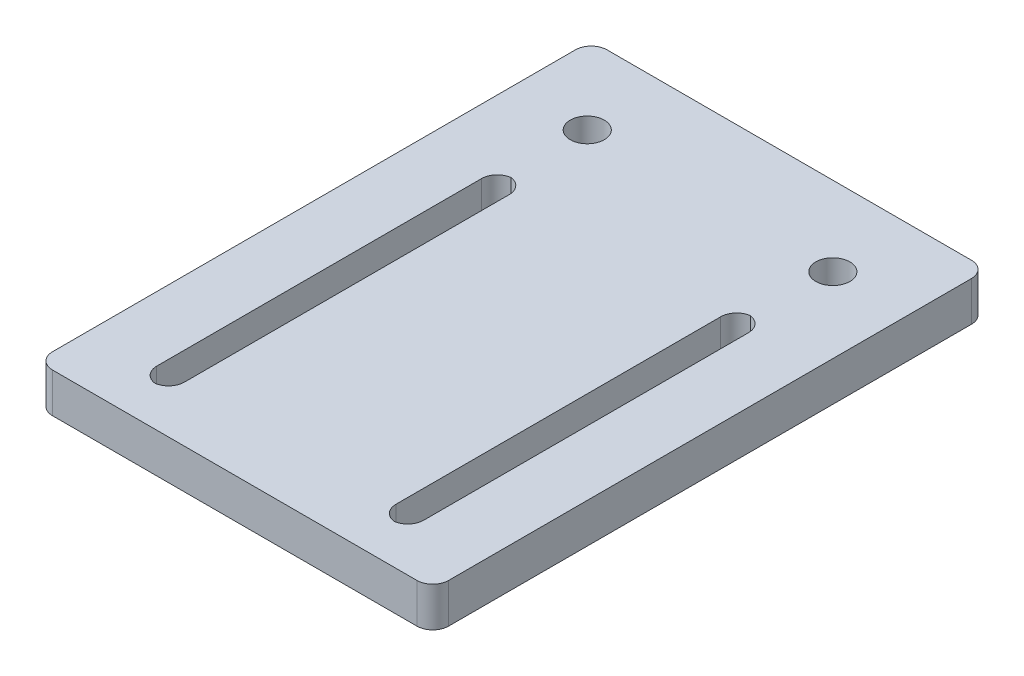
ISO-10303-21;
HEADER;
FILE_DESCRIPTION(('STEP AP214'),'2;1');
FILE_NAME('part.step','',(''),(''),'','','');
FILE_SCHEMA(('AUTOMOTIVE_DESIGN { 1 0 10303 214 1 1 1 1 }'));
ENDSEC;
DATA;
#1=APPLICATION_CONTEXT('core data for automotive mechanical design processes');
#2=APPLICATION_PROTOCOL_DEFINITION('international standard','automotive_design',2000,#1);
#3=PRODUCT_CONTEXT('',#1,'mechanical');
#4=PRODUCT('Part','Part','',(#3));
#5=PRODUCT_RELATED_PRODUCT_CATEGORY('part','',(#4));
#6=PRODUCT_DEFINITION_FORMATION('','',#4);
#7=PRODUCT_DEFINITION_CONTEXT('part definition',#1,'design');
#8=PRODUCT_DEFINITION('design','',#6,#7);
#9=PRODUCT_DEFINITION_SHAPE('','',#8);
#10=(LENGTH_UNIT() NAMED_UNIT(*) SI_UNIT(.MILLI.,.METRE.));
#11=(NAMED_UNIT(*) PLANE_ANGLE_UNIT() SI_UNIT($,.RADIAN.));
#12=(NAMED_UNIT(*) SI_UNIT($,.STERADIAN.) SOLID_ANGLE_UNIT());
#13=UNCERTAINTY_MEASURE_WITH_UNIT(LENGTH_MEASURE(1.E-05),#10,'distance_accuracy_value','');
#14=(GEOMETRIC_REPRESENTATION_CONTEXT(3) GLOBAL_UNCERTAINTY_ASSIGNED_CONTEXT((#13)) GLOBAL_UNIT_ASSIGNED_CONTEXT((#10,
#11,#12)) REPRESENTATION_CONTEXT('',''));
#15=CARTESIAN_POINT('',(0.,0.,0.));
#16=DIRECTION('',(0.,0.,1.));
#17=DIRECTION('',(1.,0.,0.));
#18=AXIS2_PLACEMENT_3D('',#15,#16,#17);
#19=CARTESIAN_POINT('',(0.,5.,0.));
#20=DIRECTION('',(0.,1.,0.));
#21=DIRECTION('',(0.,0.,1.));
#22=AXIS2_PLACEMENT_3D('',#19,#20,#21);
#23=PLANE('',#22);
#24=CARTESIAN_POINT('',(-15.5,5.,-25.));
#25=DIRECTION('',(0.,1.,0.));
#26=DIRECTION('',(0.,0.,1.));
#27=AXIS2_PLACEMENT_3D('',#24,#25,#26);
#28=CIRCLE('',#27,2.15);
#29=CARTESIAN_POINT('',(-15.5,5.,-22.85));
#30=VERTEX_POINT('',#29);
#31=EDGE_CURVE('E307',#30,#30,#28,.T.);
#32=ORIENTED_EDGE('',*,*,#31,.F.);
#33=EDGE_LOOP('',(#32));
#34=FACE_BOUND('',#33,.T.);
#35=DIRECTION('',(-1.,0.,0.));
#36=VECTOR('',#35,1.);
#37=CARTESIAN_POINT('',(-25.,5.,-35.));
#38=LINE('',#37,#36);
#39=CARTESIAN_POINT('',(23.,5.,-35.));
#40=VERTEX_POINT('',#39);
#41=CARTESIAN_POINT('',(-23.,5.,-35.));
#42=VERTEX_POINT('',#41);
#43=EDGE_CURVE('E297',#40,#42,#38,.T.);
#44=ORIENTED_EDGE('',*,*,#43,.T.);
#45=CARTESIAN_POINT('',(-23.,5.,-33.));
#46=DIRECTION('',(0.,1.,0.));
#47=DIRECTION('',(0.,0.,1.));
#48=AXIS2_PLACEMENT_3D('',#45,#46,#47);
#49=CIRCLE('',#48,2.);
#50=CARTESIAN_POINT('',(-25.,5.,-33.));
#51=VERTEX_POINT('',#50);
#52=EDGE_CURVE('E277',#42,#51,#49,.T.);
#53=ORIENTED_EDGE('',*,*,#52,.T.);
#54=DIRECTION('',(0.,0.,1.));
#55=VECTOR('',#54,1.);
#56=CARTESIAN_POINT('',(-25.,5.,-35.));
#57=LINE('',#56,#55);
#58=CARTESIAN_POINT('',(-25.,5.,33.));
#59=VERTEX_POINT('',#58);
#60=EDGE_CURVE('E309',#51,#59,#57,.T.);
#61=ORIENTED_EDGE('',*,*,#60,.T.);
#62=CARTESIAN_POINT('',(-23.,5.,33.));
#63=DIRECTION('',(0.,1.,0.));
#64=DIRECTION('',(0.,0.,1.));
#65=AXIS2_PLACEMENT_3D('',#62,#63,#64);
#66=CIRCLE('',#65,2.);
#67=CARTESIAN_POINT('',(-23.,5.,35.));
#68=VERTEX_POINT('',#67);
#69=EDGE_CURVE('E53',#59,#68,#66,.T.);
#70=ORIENTED_EDGE('',*,*,#69,.T.);
#71=DIRECTION('',(1.,0.,0.));
#72=VECTOR('',#71,1.);
#73=CARTESIAN_POINT('',(-25.,5.,35.));
#74=LINE('',#73,#72);
#75=CARTESIAN_POINT('',(23.,5.,35.));
#76=VERTEX_POINT('',#75);
#77=EDGE_CURVE('E202',#68,#76,#74,.T.);
#78=ORIENTED_EDGE('',*,*,#77,.T.);
#79=CARTESIAN_POINT('',(23.,5.,33.));
#80=DIRECTION('',(0.,1.,0.));
#81=DIRECTION('',(0.,0.,1.));
#82=AXIS2_PLACEMENT_3D('',#79,#80,#81);
#83=CIRCLE('',#82,2.);
#84=CARTESIAN_POINT('',(25.,5.,33.));
#85=VERTEX_POINT('',#84);
#86=EDGE_CURVE('E273',#76,#85,#83,.T.);
#87=ORIENTED_EDGE('',*,*,#86,.T.);
#88=DIRECTION('',(0.,0.,-1.));
#89=VECTOR('',#88,1.);
#90=CARTESIAN_POINT('',(25.,5.,-35.));
#91=LINE('',#90,#89);
#92=CARTESIAN_POINT('',(25.,5.,-33.));
#93=VERTEX_POINT('',#92);
#94=EDGE_CURVE('E294',#85,#93,#91,.T.);
#95=ORIENTED_EDGE('',*,*,#94,.T.);
#96=CARTESIAN_POINT('',(23.,5.,-33.));
#97=DIRECTION('',(0.,1.,0.));
#98=DIRECTION('',(0.,0.,1.));
#99=AXIS2_PLACEMENT_3D('',#96,#97,#98);
#100=CIRCLE('',#99,2.);
#101=EDGE_CURVE('E275',#93,#40,#100,.T.);
#102=ORIENTED_EDGE('',*,*,#101,.T.);
#103=EDGE_LOOP('',(#44,#53,#61,#70,#78,#87,#95,#102));
#104=FACE_BOUND('',#103,.T.);
#105=CARTESIAN_POINT('',(15.5,5.,-25.));
#106=DIRECTION('',(0.,1.,0.));
#107=DIRECTION('',(0.,0.,1.));
#108=AXIS2_PLACEMENT_3D('',#105,#106,#107);
#109=CIRCLE('',#108,2.15);
#110=CARTESIAN_POINT('',(15.5,5.,-22.85));
#111=VERTEX_POINT('',#110);
#112=EDGE_CURVE('E316',#111,#111,#109,.T.);
#113=ORIENTED_EDGE('',*,*,#112,.F.);
#114=EDGE_LOOP('',(#113));
#115=FACE_BOUND('',#114,.T.);
#116=CARTESIAN_POINT('',(-15.35,5.,28.));
#117=DIRECTION('',(0.,1.,0.));
#118=DIRECTION('',(0.,0.,1.));
#119=AXIS2_PLACEMENT_3D('',#116,#117,#118);
#120=CIRCLE('',#119,2.);
#121=CARTESIAN_POINT('',(-13.35,5.,28.));
#122=VERTEX_POINT('',#121);
#123=CARTESIAN_POINT('',(-15.1,5.,29.9843134832984));
#124=VERTEX_POINT('',#123);
#125=EDGE_CURVE('E218',#122,#124,#120,.F.);
#126=ORIENTED_EDGE('',*,*,#125,.T.);
#127=CARTESIAN_POINT('',(-14.85,5.,28.));
#128=DIRECTION('',(0.,1.,0.));
#129=DIRECTION('',(0.,0.,1.));
#130=AXIS2_PLACEMENT_3D('',#127,#128,#129);
#131=CIRCLE('',#130,2.);
#132=CARTESIAN_POINT('',(-16.85,5.,28.));
#133=VERTEX_POINT('',#132);
#134=EDGE_CURVE('E225',#124,#133,#131,.F.);
#135=ORIENTED_EDGE('',*,*,#134,.T.);
#136=DIRECTION('',(0.,0.,1.));
#137=VECTOR('',#136,1.);
#138=CARTESIAN_POINT('',(-16.85,5.,30.));
#139=LINE('',#138,#137);
#140=CARTESIAN_POINT('',(-16.85,5.,-13.));
#141=VERTEX_POINT('',#140);
#142=EDGE_CURVE('E328',#141,#133,#139,.T.);
#143=ORIENTED_EDGE('',*,*,#142,.F.);
#144=CARTESIAN_POINT('',(-14.85,5.,-13.));
#145=DIRECTION('',(0.,1.,0.));
#146=DIRECTION('',(0.,0.,1.));
#147=AXIS2_PLACEMENT_3D('',#144,#145,#146);
#148=CIRCLE('',#147,2.);
#149=CARTESIAN_POINT('',(-15.1,5.,-14.9843134832984));
#150=VERTEX_POINT('',#149);
#151=EDGE_CURVE('E241',#141,#150,#148,.F.);
#152=ORIENTED_EDGE('',*,*,#151,.T.);
#153=CARTESIAN_POINT('',(-15.35,5.,-13.));
#154=DIRECTION('',(0.,1.,0.));
#155=DIRECTION('',(0.,0.,1.));
#156=AXIS2_PLACEMENT_3D('',#153,#154,#155);
#157=CIRCLE('',#156,2.);
#158=CARTESIAN_POINT('',(-13.35,5.,-13.));
#159=VERTEX_POINT('',#158);
#160=EDGE_CURVE('E237',#150,#159,#157,.F.);
#161=ORIENTED_EDGE('',*,*,#160,.T.);
#162=DIRECTION('',(0.,0.,-1.));
#163=VECTOR('',#162,1.);
#164=CARTESIAN_POINT('',(-13.35,5.,30.));
#165=LINE('',#164,#163);
#166=EDGE_CURVE('E322',#122,#159,#165,.T.);
#167=ORIENTED_EDGE('',*,*,#166,.F.);
#168=EDGE_LOOP('',(#126,#135,#143,#152,#161,#167));
#169=FACE_BOUND('',#168,.T.);
#170=CARTESIAN_POINT('',(14.85,5.,28.));
#171=DIRECTION('',(0.,1.,0.));
#172=DIRECTION('',(0.,0.,1.));
#173=AXIS2_PLACEMENT_3D('',#170,#171,#172);
#174=CIRCLE('',#173,2.);
#175=CARTESIAN_POINT('',(16.85,5.,28.));
#176=VERTEX_POINT('',#175);
#177=CARTESIAN_POINT('',(15.1,5.,29.9843134832984));
#178=VERTEX_POINT('',#177);
#179=EDGE_CURVE('E181',#176,#178,#174,.F.);
#180=ORIENTED_EDGE('',*,*,#179,.T.);
#181=CARTESIAN_POINT('',(15.35,5.,28.));
#182=DIRECTION('',(0.,1.,0.));
#183=DIRECTION('',(0.,0.,1.));
#184=AXIS2_PLACEMENT_3D('',#181,#182,#183);
#185=CIRCLE('',#184,2.);
#186=CARTESIAN_POINT('',(13.35,5.,28.));
#187=VERTEX_POINT('',#186);
#188=EDGE_CURVE('E221',#178,#187,#185,.F.);
#189=ORIENTED_EDGE('',*,*,#188,.T.);
#190=DIRECTION('',(0.,0.,1.));
#191=VECTOR('',#190,1.);
#192=CARTESIAN_POINT('',(13.35,5.,30.));
#193=LINE('',#192,#191);
#194=CARTESIAN_POINT('',(13.35,5.,-13.));
#195=VERTEX_POINT('',#194);
#196=EDGE_CURVE('E193',#195,#187,#193,.T.);
#197=ORIENTED_EDGE('',*,*,#196,.F.);
#198=CARTESIAN_POINT('',(15.35,5.,-13.));
#199=DIRECTION('',(0.,1.,0.));
#200=DIRECTION('',(0.,0.,1.));
#201=AXIS2_PLACEMENT_3D('',#198,#199,#200);
#202=CIRCLE('',#201,2.);
#203=CARTESIAN_POINT('',(15.1,5.,-14.9843134832985));
#204=VERTEX_POINT('',#203);
#205=EDGE_CURVE('E233',#195,#204,#202,.F.);
#206=ORIENTED_EDGE('',*,*,#205,.T.);
#207=CARTESIAN_POINT('',(14.85,5.,-13.));
#208=DIRECTION('',(0.,1.,0.));
#209=DIRECTION('',(0.,0.,1.));
#210=AXIS2_PLACEMENT_3D('',#207,#208,#209);
#211=CIRCLE('',#210,2.);
#212=CARTESIAN_POINT('',(16.85,5.,-13.));
#213=VERTEX_POINT('',#212);
#214=EDGE_CURVE('E229',#204,#213,#211,.F.);
#215=ORIENTED_EDGE('',*,*,#214,.T.);
#216=DIRECTION('',(0.,0.,-1.));
#217=VECTOR('',#216,1.);
#218=CARTESIAN_POINT('',(16.85,5.,30.));
#219=LINE('',#218,#217);
#220=EDGE_CURVE('E332',#176,#213,#219,.T.);
#221=ORIENTED_EDGE('',*,*,#220,.F.);
#222=EDGE_LOOP('',(#180,#189,#197,#206,#215,#221));
#223=FACE_BOUND('',#222,.T.);
#224=ADVANCED_FACE('F33',(#34,#104,#115,#169,#223),#23,.T.);
#225=CARTESIAN_POINT('',(0.,0.,0.));
#226=DIRECTION('',(0.,1.,0.));
#227=DIRECTION('',(0.,0.,1.));
#228=AXIS2_PLACEMENT_3D('',#225,#226,#227);
#229=PLANE('',#228);
#230=CARTESIAN_POINT('',(-15.35,0.,-13.));
#231=DIRECTION('',(0.,1.,0.));
#232=DIRECTION('',(0.,0.,1.));
#233=AXIS2_PLACEMENT_3D('',#230,#231,#232);
#234=CIRCLE('',#233,2.);
#235=CARTESIAN_POINT('',(-13.35,0.,-13.));
#236=VERTEX_POINT('',#235);
#237=CARTESIAN_POINT('',(-15.1,0.,-14.9843134832984));
#238=VERTEX_POINT('',#237);
#239=EDGE_CURVE('E235',#236,#238,#234,.T.);
#240=ORIENTED_EDGE('',*,*,#239,.T.);
#241=CARTESIAN_POINT('',(-14.85,0.,-13.));
#242=DIRECTION('',(0.,1.,0.));
#243=DIRECTION('',(0.,0.,1.));
#244=AXIS2_PLACEMENT_3D('',#241,#242,#243);
#245=CIRCLE('',#244,2.);
#246=CARTESIAN_POINT('',(-16.85,0.,-13.));
#247=VERTEX_POINT('',#246);
#248=EDGE_CURVE('E239',#238,#247,#245,.T.);
#249=ORIENTED_EDGE('',*,*,#248,.T.);
#250=DIRECTION('',(0.,0.,1.));
#251=VECTOR('',#250,1.);
#252=CARTESIAN_POINT('',(-16.85,0.,30.));
#253=LINE('',#252,#251);
#254=CARTESIAN_POINT('',(-16.85,0.,28.));
#255=VERTEX_POINT('',#254);
#256=EDGE_CURVE('E329',#247,#255,#253,.T.);
#257=ORIENTED_EDGE('',*,*,#256,.T.);
#258=CARTESIAN_POINT('',(-14.85,0.,28.));
#259=DIRECTION('',(0.,1.,0.));
#260=DIRECTION('',(0.,0.,1.));
#261=AXIS2_PLACEMENT_3D('',#258,#259,#260);
#262=CIRCLE('',#261,2.);
#263=CARTESIAN_POINT('',(-15.1,0.,29.9843134832984));
#264=VERTEX_POINT('',#263);
#265=EDGE_CURVE('E223',#255,#264,#262,.T.);
#266=ORIENTED_EDGE('',*,*,#265,.T.);
#267=CARTESIAN_POINT('',(-15.35,0.,28.));
#268=DIRECTION('',(0.,1.,0.));
#269=DIRECTION('',(0.,0.,1.));
#270=AXIS2_PLACEMENT_3D('',#267,#268,#269);
#271=CIRCLE('',#270,2.);
#272=CARTESIAN_POINT('',(-13.35,0.,28.));
#273=VERTEX_POINT('',#272);
#274=EDGE_CURVE('E216',#264,#273,#271,.T.);
#275=ORIENTED_EDGE('',*,*,#274,.T.);
#276=DIRECTION('',(0.,0.,-1.));
#277=VECTOR('',#276,1.);
#278=CARTESIAN_POINT('',(-13.35,0.,30.));
#279=LINE('',#278,#277);
#280=EDGE_CURVE('E325',#273,#236,#279,.T.);
#281=ORIENTED_EDGE('',*,*,#280,.T.);
#282=EDGE_LOOP('',(#240,#249,#257,#266,#275,#281));
#283=FACE_BOUND('',#282,.T.);
#284=DIRECTION('',(0.,0.,1.));
#285=VECTOR('',#284,1.);
#286=CARTESIAN_POINT('',(-25.,0.,-35.));
#287=LINE('',#286,#285);
#288=CARTESIAN_POINT('',(-25.,0.,-33.));
#289=VERTEX_POINT('',#288);
#290=CARTESIAN_POINT('',(-25.,0.,33.));
#291=VERTEX_POINT('',#290);
#292=EDGE_CURVE('E295',#289,#291,#287,.T.);
#293=ORIENTED_EDGE('',*,*,#292,.F.);
#294=CARTESIAN_POINT('',(-23.,0.,-33.));
#295=DIRECTION('',(0.,1.,0.));
#296=DIRECTION('',(0.,0.,1.));
#297=AXIS2_PLACEMENT_3D('',#294,#295,#296);
#298=CIRCLE('',#297,2.);
#299=CARTESIAN_POINT('',(-23.,0.,-35.));
#300=VERTEX_POINT('',#299);
#301=EDGE_CURVE('E265',#289,#300,#298,.F.);
#302=ORIENTED_EDGE('',*,*,#301,.T.);
#303=DIRECTION('',(-1.,0.,0.));
#304=VECTOR('',#303,1.);
#305=CARTESIAN_POINT('',(-25.,0.,-35.));
#306=LINE('',#305,#304);
#307=CARTESIAN_POINT('',(23.,0.,-35.));
#308=VERTEX_POINT('',#307);
#309=EDGE_CURVE('E299',#308,#300,#306,.T.);
#310=ORIENTED_EDGE('',*,*,#309,.F.);
#311=CARTESIAN_POINT('',(23.,0.,-33.));
#312=DIRECTION('',(0.,1.,0.));
#313=DIRECTION('',(0.,0.,1.));
#314=AXIS2_PLACEMENT_3D('',#311,#312,#313);
#315=CIRCLE('',#314,2.);
#316=CARTESIAN_POINT('',(25.,0.,-33.));
#317=VERTEX_POINT('',#316);
#318=EDGE_CURVE('E263',#308,#317,#315,.F.);
#319=ORIENTED_EDGE('',*,*,#318,.T.);
#320=DIRECTION('',(0.,0.,-1.));
#321=VECTOR('',#320,1.);
#322=CARTESIAN_POINT('',(25.,0.,-35.));
#323=LINE('',#322,#321);
#324=CARTESIAN_POINT('',(25.,0.,33.));
#325=VERTEX_POINT('',#324);
#326=EDGE_CURVE('E304',#325,#317,#323,.T.);
#327=ORIENTED_EDGE('',*,*,#326,.F.);
#328=CARTESIAN_POINT('',(23.,0.,33.));
#329=DIRECTION('',(0.,1.,0.));
#330=DIRECTION('',(0.,0.,1.));
#331=AXIS2_PLACEMENT_3D('',#328,#329,#330);
#332=CIRCLE('',#331,2.);
#333=CARTESIAN_POINT('',(23.,0.,35.));
#334=VERTEX_POINT('',#333);
#335=EDGE_CURVE('E261',#325,#334,#332,.F.);
#336=ORIENTED_EDGE('',*,*,#335,.T.);
#337=DIRECTION('',(1.,0.,0.));
#338=VECTOR('',#337,1.);
#339=CARTESIAN_POINT('',(-25.,0.,35.));
#340=LINE('',#339,#338);
#341=CARTESIAN_POINT('',(-23.,0.,35.));
#342=VERTEX_POINT('',#341);
#343=EDGE_CURVE('E287',#342,#334,#340,.T.);
#344=ORIENTED_EDGE('',*,*,#343,.F.);
#345=CARTESIAN_POINT('',(-23.,0.,33.));
#346=DIRECTION('',(0.,1.,0.));
#347=DIRECTION('',(0.,0.,1.));
#348=AXIS2_PLACEMENT_3D('',#345,#346,#347);
#349=CIRCLE('',#348,2.);
#350=EDGE_CURVE('E259',#342,#291,#349,.F.);
#351=ORIENTED_EDGE('',*,*,#350,.T.);
#352=EDGE_LOOP('',(#293,#302,#310,#319,#327,#336,#344,#351));
#353=FACE_BOUND('',#352,.T.);
#354=CARTESIAN_POINT('',(-15.5,0.,-25.));
#355=DIRECTION('',(0.,1.,0.));
#356=DIRECTION('',(0.,0.,1.));
#357=AXIS2_PLACEMENT_3D('',#354,#355,#356);
#358=CIRCLE('',#357,2.15);
#359=CARTESIAN_POINT('',(-15.5,0.,-22.85));
#360=VERTEX_POINT('',#359);
#361=EDGE_CURVE('E313',#360,#360,#358,.T.);
#362=ORIENTED_EDGE('',*,*,#361,.T.);
#363=EDGE_LOOP('',(#362));
#364=FACE_BOUND('',#363,.T.);
#365=CARTESIAN_POINT('',(15.5,0.,-25.));
#366=DIRECTION('',(0.,1.,0.));
#367=DIRECTION('',(0.,0.,1.));
#368=AXIS2_PLACEMENT_3D('',#365,#366,#367);
#369=CIRCLE('',#368,2.15);
#370=CARTESIAN_POINT('',(15.5,0.,-22.85));
#371=VERTEX_POINT('',#370);
#372=EDGE_CURVE('E319',#371,#371,#369,.T.);
#373=ORIENTED_EDGE('',*,*,#372,.T.);
#374=EDGE_LOOP('',(#373));
#375=FACE_BOUND('',#374,.T.);
#376=CARTESIAN_POINT('',(14.85,0.,-13.));
#377=DIRECTION('',(0.,1.,0.));
#378=DIRECTION('',(0.,0.,1.));
#379=AXIS2_PLACEMENT_3D('',#376,#377,#378);
#380=CIRCLE('',#379,2.);
#381=CARTESIAN_POINT('',(16.85,0.,-13.));
#382=VERTEX_POINT('',#381);
#383=CARTESIAN_POINT('',(15.1,0.,-14.9843134832985));
#384=VERTEX_POINT('',#383);
#385=EDGE_CURVE('E227',#382,#384,#380,.T.);
#386=ORIENTED_EDGE('',*,*,#385,.T.);
#387=CARTESIAN_POINT('',(15.35,0.,-13.));
#388=DIRECTION('',(0.,1.,0.));
#389=DIRECTION('',(0.,0.,1.));
#390=AXIS2_PLACEMENT_3D('',#387,#388,#389);
#391=CIRCLE('',#390,2.);
#392=CARTESIAN_POINT('',(13.35,0.,-13.));
#393=VERTEX_POINT('',#392);
#394=EDGE_CURVE('E231',#384,#393,#391,.T.);
#395=ORIENTED_EDGE('',*,*,#394,.T.);
#396=DIRECTION('',(0.,0.,1.));
#397=VECTOR('',#396,1.);
#398=CARTESIAN_POINT('',(13.35,0.,30.));
#399=LINE('',#398,#397);
#400=CARTESIAN_POINT('',(13.35,0.,28.));
#401=VERTEX_POINT('',#400);
#402=EDGE_CURVE('E194',#393,#401,#399,.T.);
#403=ORIENTED_EDGE('',*,*,#402,.T.);
#404=CARTESIAN_POINT('',(15.35,0.,28.));
#405=DIRECTION('',(0.,1.,0.));
#406=DIRECTION('',(0.,0.,1.));
#407=AXIS2_PLACEMENT_3D('',#404,#405,#406);
#408=CIRCLE('',#407,2.);
#409=CARTESIAN_POINT('',(15.1,0.,29.9843134832984));
#410=VERTEX_POINT('',#409);
#411=EDGE_CURVE('E176',#401,#410,#408,.T.);
#412=ORIENTED_EDGE('',*,*,#411,.T.);
#413=CARTESIAN_POINT('',(14.85,0.,28.));
#414=DIRECTION('',(0.,1.,0.));
#415=DIRECTION('',(0.,0.,1.));
#416=AXIS2_PLACEMENT_3D('',#413,#414,#415);
#417=CIRCLE('',#416,2.);
#418=CARTESIAN_POINT('',(16.85,0.,28.));
#419=VERTEX_POINT('',#418);
#420=EDGE_CURVE('E170',#410,#419,#417,.T.);
#421=ORIENTED_EDGE('',*,*,#420,.T.);
#422=DIRECTION('',(0.,0.,-1.));
#423=VECTOR('',#422,1.);
#424=CARTESIAN_POINT('',(16.85,0.,30.));
#425=LINE('',#424,#423);
#426=EDGE_CURVE('E173',#419,#382,#425,.T.);
#427=ORIENTED_EDGE('',*,*,#426,.T.);
#428=EDGE_LOOP('',(#386,#395,#403,#412,#421,#427));
#429=FACE_BOUND('',#428,.T.);
#430=ADVANCED_FACE('F172',(#283,#353,#364,#375,#429),#229,.F.);
#431=CARTESIAN_POINT('',(25.,5.,-35.));
#432=DIRECTION('',(-1.,0.,0.));
#433=DIRECTION('',(0.,0.,1.));
#434=AXIS2_PLACEMENT_3D('',#431,#432,#433);
#435=PLANE('',#434);
#436=ORIENTED_EDGE('',*,*,#326,.T.);
#437=DIRECTION('',(0.,-1.,0.));
#438=VECTOR('',#437,1.);
#439=CARTESIAN_POINT('',(25.,5.,-33.));
#440=LINE('',#439,#438);
#441=EDGE_CURVE('E282',#317,#93,#440,.F.);
#442=ORIENTED_EDGE('',*,*,#441,.T.);
#443=ORIENTED_EDGE('',*,*,#94,.F.);
#444=DIRECTION('',(0.,-1.,0.));
#445=VECTOR('',#444,1.);
#446=CARTESIAN_POINT('',(25.,5.,33.));
#447=LINE('',#446,#445);
#448=EDGE_CURVE('E279',#85,#325,#447,.T.);
#449=ORIENTED_EDGE('',*,*,#448,.T.);
#450=EDGE_LOOP('',(#436,#442,#443,#449));
#451=FACE_BOUND('',#450,.T.);
#452=ADVANCED_FACE('F377',(#451),#435,.F.);
#453=CARTESIAN_POINT('',(-25.,5.,-35.));
#454=DIRECTION('',(0.,0.,1.));
#455=DIRECTION('',(1.,0.,0.));
#456=AXIS2_PLACEMENT_3D('',#453,#454,#455);
#457=PLANE('',#456);
#458=ORIENTED_EDGE('',*,*,#309,.T.);
#459=DIRECTION('',(0.,-1.,0.));
#460=VECTOR('',#459,1.);
#461=CARTESIAN_POINT('',(-23.,5.,-35.));
#462=LINE('',#461,#460);
#463=EDGE_CURVE('E270',#300,#42,#462,.F.);
#464=ORIENTED_EDGE('',*,*,#463,.T.);
#465=ORIENTED_EDGE('',*,*,#43,.F.);
#466=DIRECTION('',(0.,-1.,0.));
#467=VECTOR('',#466,1.);
#468=CARTESIAN_POINT('',(23.,5.,-35.));
#469=LINE('',#468,#467);
#470=EDGE_CURVE('E267',#40,#308,#469,.T.);
#471=ORIENTED_EDGE('',*,*,#470,.T.);
#472=EDGE_LOOP('',(#458,#464,#465,#471));
#473=FACE_BOUND('',#472,.T.);
#474=ADVANCED_FACE('F390',(#473),#457,.F.);
#475=CARTESIAN_POINT('',(-25.,5.,-35.));
#476=DIRECTION('',(1.,0.,0.));
#477=DIRECTION('',(0.,0.,-1.));
#478=AXIS2_PLACEMENT_3D('',#475,#476,#477);
#479=PLANE('',#478);
#480=ORIENTED_EDGE('',*,*,#60,.F.);
#481=DIRECTION('',(0.,-1.,0.));
#482=VECTOR('',#481,1.);
#483=CARTESIAN_POINT('',(-25.,5.,-33.));
#484=LINE('',#483,#482);
#485=EDGE_CURVE('E256',#51,#289,#484,.T.);
#486=ORIENTED_EDGE('',*,*,#485,.T.);
#487=ORIENTED_EDGE('',*,*,#292,.T.);
#488=DIRECTION('',(0.,-1.,0.));
#489=VECTOR('',#488,1.);
#490=CARTESIAN_POINT('',(-25.,5.,33.));
#491=LINE('',#490,#489);
#492=EDGE_CURVE('E243',#291,#59,#491,.F.);
#493=ORIENTED_EDGE('',*,*,#492,.T.);
#494=EDGE_LOOP('',(#480,#486,#487,#493));
#495=FACE_BOUND('',#494,.T.);
#496=ADVANCED_FACE('F387',(#495),#479,.F.);
#497=CARTESIAN_POINT('',(-25.,5.,35.));
#498=DIRECTION('',(0.,0.,-1.));
#499=DIRECTION('',(-1.,0.,0.));
#500=AXIS2_PLACEMENT_3D('',#497,#498,#499);
#501=PLANE('',#500);
#502=ORIENTED_EDGE('',*,*,#343,.T.);
#503=DIRECTION('',(0.,-1.,0.));
#504=VECTOR('',#503,1.);
#505=CARTESIAN_POINT('',(23.,5.,35.));
#506=LINE('',#505,#504);
#507=EDGE_CURVE('E11',#334,#76,#506,.F.);
#508=ORIENTED_EDGE('',*,*,#507,.T.);
#509=ORIENTED_EDGE('',*,*,#77,.F.);
#510=DIRECTION('',(0.,-1.,0.));
#511=VECTOR('',#510,1.);
#512=CARTESIAN_POINT('',(-23.,5.,35.));
#513=LINE('',#512,#511);
#514=EDGE_CURVE('E41',#68,#342,#513,.T.);
#515=ORIENTED_EDGE('',*,*,#514,.T.);
#516=EDGE_LOOP('',(#502,#508,#509,#515));
#517=FACE_BOUND('',#516,.T.);
#518=ADVANCED_FACE('F286',(#517),#501,.F.);
#519=CARTESIAN_POINT('',(-15.5,5.,-25.));
#520=DIRECTION('',(0.,-1.,0.));
#521=DIRECTION('',(0.,0.,-1.));
#522=AXIS2_PLACEMENT_3D('',#519,#520,#521);
#523=CYLINDRICAL_SURFACE('',#522,2.15);
#524=ORIENTED_EDGE('',*,*,#31,.T.);
#525=EDGE_LOOP('',(#524));
#526=FACE_BOUND('',#525,.T.);
#527=ORIENTED_EDGE('',*,*,#361,.F.);
#528=EDGE_LOOP('',(#527));
#529=FACE_BOUND('',#528,.T.);
#530=ADVANCED_FACE('F382',(#526,#529),#523,.F.);
#531=CARTESIAN_POINT('',(15.5,5.,-25.));
#532=DIRECTION('',(0.,-1.,0.));
#533=DIRECTION('',(0.,0.,-1.));
#534=AXIS2_PLACEMENT_3D('',#531,#532,#533);
#535=CYLINDRICAL_SURFACE('',#534,2.15);
#536=ORIENTED_EDGE('',*,*,#112,.T.);
#537=EDGE_LOOP('',(#536));
#538=FACE_BOUND('',#537,.T.);
#539=ORIENTED_EDGE('',*,*,#372,.F.);
#540=EDGE_LOOP('',(#539));
#541=FACE_BOUND('',#540,.T.);
#542=ADVANCED_FACE('F437',(#538,#541),#535,.F.);
#543=CARTESIAN_POINT('',(-16.85,5.,30.));
#544=DIRECTION('',(1.,0.,0.));
#545=DIRECTION('',(0.,0.,-1.));
#546=AXIS2_PLACEMENT_3D('',#543,#544,#545);
#547=PLANE('',#546);
#548=ORIENTED_EDGE('',*,*,#142,.T.);
#549=DIRECTION('',(0.,-1.,0.));
#550=VECTOR('',#549,1.);
#551=CARTESIAN_POINT('',(-16.85,0.,28.));
#552=LINE('',#551,#550);
#553=EDGE_CURVE('E182',#133,#255,#552,.T.);
#554=ORIENTED_EDGE('',*,*,#553,.T.);
#555=ORIENTED_EDGE('',*,*,#256,.F.);
#556=DIRECTION('',(0.,-1.,0.));
#557=VECTOR('',#556,1.);
#558=CARTESIAN_POINT('',(-16.85,5.,-13.));
#559=LINE('',#558,#557);
#560=EDGE_CURVE('E212',#247,#141,#559,.F.);
#561=ORIENTED_EDGE('',*,*,#560,.T.);
#562=EDGE_LOOP('',(#548,#554,#555,#561));
#563=FACE_BOUND('',#562,.T.);
#564=ADVANCED_FACE('F412',(#563),#547,.T.);
#565=CARTESIAN_POINT('',(-13.35,5.,30.));
#566=DIRECTION('',(-1.,0.,0.));
#567=DIRECTION('',(0.,0.,1.));
#568=AXIS2_PLACEMENT_3D('',#565,#566,#567);
#569=PLANE('',#568);
#570=ORIENTED_EDGE('',*,*,#280,.F.);
#571=DIRECTION('',(0.,-1.,0.));
#572=VECTOR('',#571,1.);
#573=CARTESIAN_POINT('',(-13.35,5.,28.));
#574=LINE('',#573,#572);
#575=EDGE_CURVE('E200',#273,#122,#574,.F.);
#576=ORIENTED_EDGE('',*,*,#575,.T.);
#577=ORIENTED_EDGE('',*,*,#166,.T.);
#578=DIRECTION('',(0.,-1.,0.));
#579=VECTOR('',#578,1.);
#580=CARTESIAN_POINT('',(-13.35,0.,-13.));
#581=LINE('',#580,#579);
#582=EDGE_CURVE('E197',#159,#236,#581,.T.);
#583=ORIENTED_EDGE('',*,*,#582,.T.);
#584=EDGE_LOOP('',(#570,#576,#577,#583));
#585=FACE_BOUND('',#584,.T.);
#586=ADVANCED_FACE('F427',(#585),#569,.T.);
#587=CARTESIAN_POINT('',(13.35,5.,30.));
#588=DIRECTION('',(1.,0.,0.));
#589=DIRECTION('',(0.,0.,-1.));
#590=AXIS2_PLACEMENT_3D('',#587,#588,#589);
#591=PLANE('',#590);
#592=ORIENTED_EDGE('',*,*,#196,.T.);
#593=DIRECTION('',(0.,-1.,0.));
#594=VECTOR('',#593,1.);
#595=CARTESIAN_POINT('',(13.35,0.,28.));
#596=LINE('',#595,#594);
#597=EDGE_CURVE('E210',#187,#401,#596,.T.);
#598=ORIENTED_EDGE('',*,*,#597,.T.);
#599=ORIENTED_EDGE('',*,*,#402,.F.);
#600=DIRECTION('',(0.,-1.,0.));
#601=VECTOR('',#600,1.);
#602=CARTESIAN_POINT('',(13.35,5.,-13.));
#603=LINE('',#602,#601);
#604=EDGE_CURVE('E208',#393,#195,#603,.F.);
#605=ORIENTED_EDGE('',*,*,#604,.T.);
#606=EDGE_LOOP('',(#592,#598,#599,#605));
#607=FACE_BOUND('',#606,.T.);
#608=ADVANCED_FACE('F343',(#607),#591,.T.);
#609=CARTESIAN_POINT('',(16.85,5.,30.));
#610=DIRECTION('',(-1.,0.,0.));
#611=DIRECTION('',(0.,0.,1.));
#612=AXIS2_PLACEMENT_3D('',#609,#610,#611);
#613=PLANE('',#612);
#614=ORIENTED_EDGE('',*,*,#426,.F.);
#615=DIRECTION('',(0.,-1.,0.));
#616=VECTOR('',#615,1.);
#617=CARTESIAN_POINT('',(16.85,5.,28.));
#618=LINE('',#617,#616);
#619=EDGE_CURVE('E189',#419,#176,#618,.F.);
#620=ORIENTED_EDGE('',*,*,#619,.T.);
#621=ORIENTED_EDGE('',*,*,#220,.T.);
#622=DIRECTION('',(0.,-1.,0.));
#623=VECTOR('',#622,1.);
#624=CARTESIAN_POINT('',(16.85,0.,-13.));
#625=LINE('',#624,#623);
#626=EDGE_CURVE('E192',#213,#382,#625,.T.);
#627=ORIENTED_EDGE('',*,*,#626,.T.);
#628=EDGE_LOOP('',(#614,#620,#621,#627));
#629=FACE_BOUND('',#628,.T.);
#630=ADVANCED_FACE('F187',(#629),#613,.T.);
#631=CARTESIAN_POINT('',(15.35,5.,28.));
#632=DIRECTION('',(0.,1.,0.));
#633=DIRECTION('',(0.,0.,1.));
#634=AXIS2_PLACEMENT_3D('',#631,#632,#633);
#635=CYLINDRICAL_SURFACE('',#634,2.);
#636=ORIENTED_EDGE('',*,*,#597,.F.);
#637=ORIENTED_EDGE('',*,*,#188,.F.);
#638=DIRECTION('',(0.,1.,0.));
#639=VECTOR('',#638,1.);
#640=CARTESIAN_POINT('',(15.1,2.5,29.9843134832984));
#641=LINE('',#640,#639);
#642=EDGE_CURVE('E244',#410,#178,#641,.T.);
#643=ORIENTED_EDGE('',*,*,#642,.F.);
#644=ORIENTED_EDGE('',*,*,#411,.F.);
#645=EDGE_LOOP('',(#636,#637,#643,#644));
#646=FACE_BOUND('',#645,.T.);
#647=ADVANCED_FACE('F350',(#646),#635,.F.);
#648=CARTESIAN_POINT('',(14.85,5.,28.));
#649=DIRECTION('',(0.,1.,0.));
#650=DIRECTION('',(0.,0.,1.));
#651=AXIS2_PLACEMENT_3D('',#648,#649,#650);
#652=CYLINDRICAL_SURFACE('',#651,2.);
#653=ORIENTED_EDGE('',*,*,#179,.F.);
#654=ORIENTED_EDGE('',*,*,#619,.F.);
#655=ORIENTED_EDGE('',*,*,#420,.F.);
#656=ORIENTED_EDGE('',*,*,#642,.T.);
#657=EDGE_LOOP('',(#653,#654,#655,#656));
#658=FACE_BOUND('',#657,.T.);
#659=ADVANCED_FACE('F196',(#658),#652,.F.);
#660=CARTESIAN_POINT('',(-14.85,5.,28.));
#661=DIRECTION('',(0.,1.,0.));
#662=DIRECTION('',(0.,0.,1.));
#663=AXIS2_PLACEMENT_3D('',#660,#661,#662);
#664=CYLINDRICAL_SURFACE('',#663,2.);
#665=ORIENTED_EDGE('',*,*,#553,.F.);
#666=ORIENTED_EDGE('',*,*,#134,.F.);
#667=DIRECTION('',(0.,1.,0.));
#668=VECTOR('',#667,1.);
#669=CARTESIAN_POINT('',(-15.1,2.5,29.9843134832984));
#670=LINE('',#669,#668);
#671=EDGE_CURVE('E246',#264,#124,#670,.T.);
#672=ORIENTED_EDGE('',*,*,#671,.F.);
#673=ORIENTED_EDGE('',*,*,#265,.F.);
#674=EDGE_LOOP('',(#665,#666,#672,#673));
#675=FACE_BOUND('',#674,.T.);
#676=ADVANCED_FACE('F367',(#675),#664,.F.);
#677=CARTESIAN_POINT('',(-15.35,5.,28.));
#678=DIRECTION('',(0.,1.,0.));
#679=DIRECTION('',(0.,0.,1.));
#680=AXIS2_PLACEMENT_3D('',#677,#678,#679);
#681=CYLINDRICAL_SURFACE('',#680,2.);
#682=ORIENTED_EDGE('',*,*,#125,.F.);
#683=ORIENTED_EDGE('',*,*,#575,.F.);
#684=ORIENTED_EDGE('',*,*,#274,.F.);
#685=ORIENTED_EDGE('',*,*,#671,.T.);
#686=EDGE_LOOP('',(#682,#683,#684,#685));
#687=FACE_BOUND('',#686,.T.);
#688=ADVANCED_FACE('F359',(#687),#681,.F.);
#689=CARTESIAN_POINT('',(15.35,5.,-13.));
#690=DIRECTION('',(0.,1.,0.));
#691=DIRECTION('',(0.,0.,1.));
#692=AXIS2_PLACEMENT_3D('',#689,#690,#691);
#693=CYLINDRICAL_SURFACE('',#692,2.);
#694=DIRECTION('',(0.,1.,0.));
#695=VECTOR('',#694,1.);
#696=CARTESIAN_POINT('',(15.1,2.5,-14.9843134832985));
#697=LINE('',#696,#695);
#698=EDGE_CURVE('E249',#204,#384,#697,.F.);
#699=ORIENTED_EDGE('',*,*,#698,.F.);
#700=ORIENTED_EDGE('',*,*,#205,.F.);
#701=ORIENTED_EDGE('',*,*,#604,.F.);
#702=ORIENTED_EDGE('',*,*,#394,.F.);
#703=EDGE_LOOP('',(#699,#700,#701,#702));
#704=FACE_BOUND('',#703,.T.);
#705=ADVANCED_FACE('F357',(#704),#693,.F.);
#706=CARTESIAN_POINT('',(14.85,5.,-13.));
#707=DIRECTION('',(0.,1.,0.));
#708=DIRECTION('',(0.,0.,1.));
#709=AXIS2_PLACEMENT_3D('',#706,#707,#708);
#710=CYLINDRICAL_SURFACE('',#709,2.);
#711=ORIENTED_EDGE('',*,*,#214,.F.);
#712=ORIENTED_EDGE('',*,*,#698,.T.);
#713=ORIENTED_EDGE('',*,*,#385,.F.);
#714=ORIENTED_EDGE('',*,*,#626,.F.);
#715=EDGE_LOOP('',(#711,#712,#713,#714));
#716=FACE_BOUND('',#715,.T.);
#717=ADVANCED_FACE('F353',(#716),#710,.F.);
#718=CARTESIAN_POINT('',(-14.85,5.,-13.));
#719=DIRECTION('',(0.,1.,0.));
#720=DIRECTION('',(0.,0.,1.));
#721=AXIS2_PLACEMENT_3D('',#718,#719,#720);
#722=CYLINDRICAL_SURFACE('',#721,2.);
#723=DIRECTION('',(0.,1.,0.));
#724=VECTOR('',#723,1.);
#725=CARTESIAN_POINT('',(-15.1,2.5,-14.9843134832984));
#726=LINE('',#725,#724);
#727=EDGE_CURVE('E252',#150,#238,#726,.F.);
#728=ORIENTED_EDGE('',*,*,#727,.F.);
#729=ORIENTED_EDGE('',*,*,#151,.F.);
#730=ORIENTED_EDGE('',*,*,#560,.F.);
#731=ORIENTED_EDGE('',*,*,#248,.F.);
#732=EDGE_LOOP('',(#728,#729,#730,#731));
#733=FACE_BOUND('',#732,.T.);
#734=ADVANCED_FACE('F365',(#733),#722,.F.);
#735=CARTESIAN_POINT('',(-15.35,5.,-13.));
#736=DIRECTION('',(0.,1.,0.));
#737=DIRECTION('',(0.,0.,1.));
#738=AXIS2_PLACEMENT_3D('',#735,#736,#737);
#739=CYLINDRICAL_SURFACE('',#738,2.);
#740=ORIENTED_EDGE('',*,*,#160,.F.);
#741=ORIENTED_EDGE('',*,*,#727,.T.);
#742=ORIENTED_EDGE('',*,*,#239,.F.);
#743=ORIENTED_EDGE('',*,*,#582,.F.);
#744=EDGE_LOOP('',(#740,#741,#742,#743));
#745=FACE_BOUND('',#744,.T.);
#746=ADVANCED_FACE('F421',(#745),#739,.F.);
#747=CARTESIAN_POINT('',(-23.,5.,-33.));
#748=DIRECTION('',(0.,-1.,0.));
#749=DIRECTION('',(0.,0.,-1.));
#750=AXIS2_PLACEMENT_3D('',#747,#748,#749);
#751=CYLINDRICAL_SURFACE('',#750,2.);
#752=ORIENTED_EDGE('',*,*,#52,.F.);
#753=ORIENTED_EDGE('',*,*,#463,.F.);
#754=ORIENTED_EDGE('',*,*,#301,.F.);
#755=ORIENTED_EDGE('',*,*,#485,.F.);
#756=EDGE_LOOP('',(#752,#753,#754,#755));
#757=FACE_BOUND('',#756,.T.);
#758=ADVANCED_FACE('F489',(#757),#751,.T.);
#759=CARTESIAN_POINT('',(23.,5.,-33.));
#760=DIRECTION('',(0.,-1.,0.));
#761=DIRECTION('',(0.,0.,-1.));
#762=AXIS2_PLACEMENT_3D('',#759,#760,#761);
#763=CYLINDRICAL_SURFACE('',#762,2.);
#764=ORIENTED_EDGE('',*,*,#101,.F.);
#765=ORIENTED_EDGE('',*,*,#441,.F.);
#766=ORIENTED_EDGE('',*,*,#318,.F.);
#767=ORIENTED_EDGE('',*,*,#470,.F.);
#768=EDGE_LOOP('',(#764,#765,#766,#767));
#769=FACE_BOUND('',#768,.T.);
#770=ADVANCED_FACE('F573',(#769),#763,.T.);
#771=CARTESIAN_POINT('',(23.,5.,33.));
#772=DIRECTION('',(0.,-1.,0.));
#773=DIRECTION('',(0.,0.,-1.));
#774=AXIS2_PLACEMENT_3D('',#771,#772,#773);
#775=CYLINDRICAL_SURFACE('',#774,2.);
#776=ORIENTED_EDGE('',*,*,#86,.F.);
#777=ORIENTED_EDGE('',*,*,#507,.F.);
#778=ORIENTED_EDGE('',*,*,#335,.F.);
#779=ORIENTED_EDGE('',*,*,#448,.F.);
#780=EDGE_LOOP('',(#776,#777,#778,#779));
#781=FACE_BOUND('',#780,.T.);
#782=ADVANCED_FACE('F576',(#781),#775,.T.);
#783=CARTESIAN_POINT('',(-23.,5.,33.));
#784=DIRECTION('',(0.,-1.,0.));
#785=DIRECTION('',(0.,0.,-1.));
#786=AXIS2_PLACEMENT_3D('',#783,#784,#785);
#787=CYLINDRICAL_SURFACE('',#786,2.);
#788=ORIENTED_EDGE('',*,*,#69,.F.);
#789=ORIENTED_EDGE('',*,*,#492,.F.);
#790=ORIENTED_EDGE('',*,*,#350,.F.);
#791=ORIENTED_EDGE('',*,*,#514,.F.);
#792=EDGE_LOOP('',(#788,#789,#790,#791));
#793=FACE_BOUND('',#792,.T.);
#794=ADVANCED_FACE('F35',(#793),#787,.T.);
#795=CLOSED_SHELL('',(#224,#430,#452,#474,#496,#518,#530,#542,#564,#586,#608,#630,#647,#659,
#676,#688,#705,#717,#734,#746,#758,#770,#782,#794));
#796=MANIFOLD_SOLID_BREP('B2',#795);
#797=ADVANCED_BREP_SHAPE_REPRESENTATION('',(#18,#796),#14);
#798=SHAPE_DEFINITION_REPRESENTATION(#9,#797);
ENDSEC;
END-ISO-10303-21;
